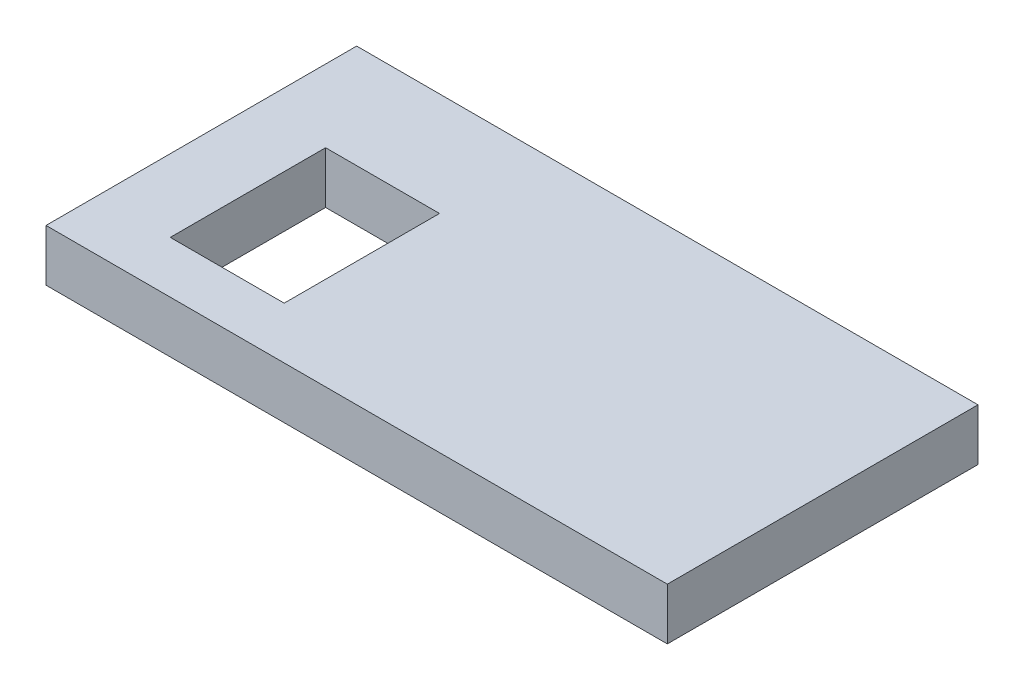
ISO-10303-21;
HEADER;
FILE_DESCRIPTION(('STEP AP214'),'2;1');
FILE_NAME('part.step','',(''),(''),'','','');
FILE_SCHEMA(('AUTOMOTIVE_DESIGN { 1 0 10303 214 1 1 1 1 }'));
ENDSEC;
DATA;
#1=APPLICATION_CONTEXT('core data for automotive mechanical design processes');
#2=APPLICATION_PROTOCOL_DEFINITION('international standard','automotive_design',2000,#1);
#3=PRODUCT_CONTEXT('',#1,'mechanical');
#4=PRODUCT('Part','Part','',(#3));
#5=PRODUCT_RELATED_PRODUCT_CATEGORY('part','',(#4));
#6=PRODUCT_DEFINITION_FORMATION('','',#4);
#7=PRODUCT_DEFINITION_CONTEXT('part definition',#1,'design');
#8=PRODUCT_DEFINITION('design','',#6,#7);
#9=PRODUCT_DEFINITION_SHAPE('','',#8);
#10=(LENGTH_UNIT() NAMED_UNIT(*) SI_UNIT(.MILLI.,.METRE.));
#11=(NAMED_UNIT(*) PLANE_ANGLE_UNIT() SI_UNIT($,.RADIAN.));
#12=(NAMED_UNIT(*) SI_UNIT($,.STERADIAN.) SOLID_ANGLE_UNIT());
#13=UNCERTAINTY_MEASURE_WITH_UNIT(LENGTH_MEASURE(1.E-05),#10,'distance_accuracy_value','');
#14=(GEOMETRIC_REPRESENTATION_CONTEXT(3) GLOBAL_UNCERTAINTY_ASSIGNED_CONTEXT((#13)) GLOBAL_UNIT_ASSIGNED_CONTEXT((#10,
#11,#12)) REPRESENTATION_CONTEXT('',''));
#15=CARTESIAN_POINT('',(0.,0.,0.));
#16=DIRECTION('',(0.,0.,1.));
#17=DIRECTION('',(1.,0.,0.));
#18=AXIS2_PLACEMENT_3D('',#15,#16,#17);
#19=CARTESIAN_POINT('',(60.,10.,-25.));
#20=DIRECTION('',(-1.,0.,0.));
#21=DIRECTION('',(0.,0.,1.));
#22=AXIS2_PLACEMENT_3D('',#19,#20,#21);
#23=PLANE('',#22);
#24=DIRECTION('',(0.,0.,-1.));
#25=VECTOR('',#24,1.);
#26=CARTESIAN_POINT('',(60.,0.,-25.));
#27=LINE('',#26,#25);
#28=CARTESIAN_POINT('',(60.,0.,25.));
#29=VERTEX_POINT('',#28);
#30=CARTESIAN_POINT('',(60.,0.,-35.));
#31=VERTEX_POINT('',#30);
#32=EDGE_CURVE('E113',#29,#31,#27,.T.);
#33=ORIENTED_EDGE('',*,*,#32,.T.);
#34=DIRECTION('',(0.,1.,0.));
#35=VECTOR('',#34,1.);
#36=CARTESIAN_POINT('',(60.,-120.415945787923,-35.));
#37=LINE('',#36,#35);
#38=CARTESIAN_POINT('',(60.,10.,-35.));
#39=VERTEX_POINT('',#38);
#40=EDGE_CURVE('E111',#31,#39,#37,.T.);
#41=ORIENTED_EDGE('',*,*,#40,.T.);
#42=DIRECTION('',(0.,0.,-1.));
#43=VECTOR('',#42,1.);
#44=CARTESIAN_POINT('',(60.,10.,-25.));
#45=LINE('',#44,#43);
#46=CARTESIAN_POINT('',(60.,10.,25.));
#47=VERTEX_POINT('',#46);
#48=EDGE_CURVE('E97',#47,#39,#45,.T.);
#49=ORIENTED_EDGE('',*,*,#48,.F.);
#50=DIRECTION('',(0.,-1.,0.));
#51=VECTOR('',#50,1.);
#52=CARTESIAN_POINT('',(60.,10.,25.));
#53=LINE('',#52,#51);
#54=EDGE_CURVE('E40',#47,#29,#53,.T.);
#55=ORIENTED_EDGE('',*,*,#54,.T.);
#56=EDGE_LOOP('',(#33,#41,#49,#55));
#57=FACE_BOUND('',#56,.T.);
#58=ADVANCED_FACE('F33',(#57),#23,.F.);
#59=CARTESIAN_POINT('',(-60.,10.,-25.));
#60=DIRECTION('',(1.,0.,0.));
#61=DIRECTION('',(0.,0.,-1.));
#62=AXIS2_PLACEMENT_3D('',#59,#60,#61);
#63=PLANE('',#62);
#64=DIRECTION('',(0.,0.,1.));
#65=VECTOR('',#64,1.);
#66=CARTESIAN_POINT('',(-60.,0.,-25.));
#67=LINE('',#66,#65);
#68=CARTESIAN_POINT('',(-60.,0.,-35.));
#69=VERTEX_POINT('',#68);
#70=CARTESIAN_POINT('',(-60.,0.,25.));
#71=VERTEX_POINT('',#70);
#72=EDGE_CURVE('E158',#69,#71,#67,.T.);
#73=ORIENTED_EDGE('',*,*,#72,.T.);
#74=DIRECTION('',(0.,-1.,0.));
#75=VECTOR('',#74,1.);
#76=CARTESIAN_POINT('',(-60.,10.,25.));
#77=LINE('',#76,#75);
#78=CARTESIAN_POINT('',(-60.,10.,25.));
#79=VERTEX_POINT('',#78);
#80=EDGE_CURVE('E11',#79,#71,#77,.T.);
#81=ORIENTED_EDGE('',*,*,#80,.F.);
#82=DIRECTION('',(0.,0.,1.));
#83=VECTOR('',#82,1.);
#84=CARTESIAN_POINT('',(-60.,10.,-25.));
#85=LINE('',#84,#83);
#86=CARTESIAN_POINT('',(-60.,10.,-35.));
#87=VERTEX_POINT('',#86);
#88=EDGE_CURVE('E107',#87,#79,#85,.T.);
#89=ORIENTED_EDGE('',*,*,#88,.F.);
#90=DIRECTION('',(0.,1.,0.));
#91=VECTOR('',#90,1.);
#92=CARTESIAN_POINT('',(-60.,-120.415945787923,-35.));
#93=LINE('',#92,#91);
#94=EDGE_CURVE('E117',#69,#87,#93,.T.);
#95=ORIENTED_EDGE('',*,*,#94,.F.);
#96=EDGE_LOOP('',(#73,#81,#89,#95));
#97=FACE_BOUND('',#96,.T.);
#98=ADVANCED_FACE('F166',(#97),#63,.F.);
#99=CARTESIAN_POINT('',(-60.,10.,25.));
#100=DIRECTION('',(0.,0.,-1.));
#101=DIRECTION('',(-1.,0.,0.));
#102=AXIS2_PLACEMENT_3D('',#99,#100,#101);
#103=PLANE('',#102);
#104=DIRECTION('',(1.,0.,0.));
#105=VECTOR('',#104,1.);
#106=CARTESIAN_POINT('',(-60.,0.,25.));
#107=LINE('',#106,#105);
#108=EDGE_CURVE('E108',#71,#29,#107,.T.);
#109=ORIENTED_EDGE('',*,*,#108,.T.);
#110=ORIENTED_EDGE('',*,*,#54,.F.);
#111=DIRECTION('',(1.,0.,0.));
#112=VECTOR('',#111,1.);
#113=CARTESIAN_POINT('',(-60.,10.,25.));
#114=LINE('',#113,#112);
#115=EDGE_CURVE('E103',#79,#47,#114,.T.);
#116=ORIENTED_EDGE('',*,*,#115,.F.);
#117=ORIENTED_EDGE('',*,*,#80,.T.);
#118=EDGE_LOOP('',(#109,#110,#116,#117));
#119=FACE_BOUND('',#118,.T.);
#120=ADVANCED_FACE('F167',(#119),#103,.F.);
#121=CARTESIAN_POINT('',(0.,10.,0.));
#122=DIRECTION('',(0.,1.,0.));
#123=DIRECTION('',(0.,0.,1.));
#124=AXIS2_PLACEMENT_3D('',#121,#122,#123);
#125=PLANE('',#124);
#126=DIRECTION('',(0.,0.,-1.));
#127=VECTOR('',#126,1.);
#128=CARTESIAN_POINT('',(-24.,10.,-15.));
#129=LINE('',#128,#127);
#130=CARTESIAN_POINT('',(-24.,10.,15.));
#131=VERTEX_POINT('',#130);
#132=CARTESIAN_POINT('',(-24.,10.,-15.));
#133=VERTEX_POINT('',#132);
#134=EDGE_CURVE('E47',#131,#133,#129,.T.);
#135=ORIENTED_EDGE('',*,*,#134,.F.);
#136=DIRECTION('',(1.,0.,0.));
#137=VECTOR('',#136,1.);
#138=CARTESIAN_POINT('',(-46.,10.,15.));
#139=LINE('',#138,#137);
#140=CARTESIAN_POINT('',(-46.,10.,15.));
#141=VERTEX_POINT('',#140);
#142=EDGE_CURVE('E131',#141,#131,#139,.T.);
#143=ORIENTED_EDGE('',*,*,#142,.F.);
#144=DIRECTION('',(0.,0.,1.));
#145=VECTOR('',#144,1.);
#146=CARTESIAN_POINT('',(-46.,10.,-15.));
#147=LINE('',#146,#145);
#148=CARTESIAN_POINT('',(-46.,10.,-15.));
#149=VERTEX_POINT('',#148);
#150=EDGE_CURVE('E143',#149,#141,#147,.T.);
#151=ORIENTED_EDGE('',*,*,#150,.F.);
#152=DIRECTION('',(-1.,0.,0.));
#153=VECTOR('',#152,1.);
#154=CARTESIAN_POINT('',(-46.,10.,-15.));
#155=LINE('',#154,#153);
#156=EDGE_CURVE('E140',#133,#149,#155,.T.);
#157=ORIENTED_EDGE('',*,*,#156,.F.);
#158=EDGE_LOOP('',(#135,#143,#151,#157));
#159=FACE_BOUND('',#158,.T.);
#160=ORIENTED_EDGE('',*,*,#48,.T.);
#161=DIRECTION('',(-1.,0.,0.));
#162=VECTOR('',#161,1.);
#163=CARTESIAN_POINT('',(60.,10.,-35.));
#164=LINE('',#163,#162);
#165=EDGE_CURVE('E101',#39,#87,#164,.T.);
#166=ORIENTED_EDGE('',*,*,#165,.T.);
#167=ORIENTED_EDGE('',*,*,#88,.T.);
#168=ORIENTED_EDGE('',*,*,#115,.T.);
#169=EDGE_LOOP('',(#160,#166,#167,#168));
#170=FACE_BOUND('',#169,.T.);
#171=ADVANCED_FACE('F99',(#159,#170),#125,.T.);
#172=CARTESIAN_POINT('',(0.,0.,0.));
#173=DIRECTION('',(0.,1.,0.));
#174=DIRECTION('',(0.,0.,1.));
#175=AXIS2_PLACEMENT_3D('',#172,#173,#174);
#176=PLANE('',#175);
#177=DIRECTION('',(1.,0.,0.));
#178=VECTOR('',#177,1.);
#179=CARTESIAN_POINT('',(-46.,0.,15.));
#180=LINE('',#179,#178);
#181=CARTESIAN_POINT('',(-46.,0.,15.));
#182=VERTEX_POINT('',#181);
#183=CARTESIAN_POINT('',(-24.,0.,15.));
#184=VERTEX_POINT('',#183);
#185=EDGE_CURVE('E135',#182,#184,#180,.T.);
#186=ORIENTED_EDGE('',*,*,#185,.T.);
#187=DIRECTION('',(0.,0.,-1.));
#188=VECTOR('',#187,1.);
#189=CARTESIAN_POINT('',(-24.,0.,-15.));
#190=LINE('',#189,#188);
#191=CARTESIAN_POINT('',(-24.,0.,-15.));
#192=VERTEX_POINT('',#191);
#193=EDGE_CURVE('E127',#184,#192,#190,.T.);
#194=ORIENTED_EDGE('',*,*,#193,.T.);
#195=DIRECTION('',(-1.,0.,0.));
#196=VECTOR('',#195,1.);
#197=CARTESIAN_POINT('',(-46.,0.,-15.));
#198=LINE('',#197,#196);
#199=CARTESIAN_POINT('',(-46.,0.,-15.));
#200=VERTEX_POINT('',#199);
#201=EDGE_CURVE('E130',#192,#200,#198,.T.);
#202=ORIENTED_EDGE('',*,*,#201,.T.);
#203=DIRECTION('',(0.,0.,1.));
#204=VECTOR('',#203,1.);
#205=CARTESIAN_POINT('',(-46.,0.,-15.));
#206=LINE('',#205,#204);
#207=EDGE_CURVE('E55',#200,#182,#206,.T.);
#208=ORIENTED_EDGE('',*,*,#207,.T.);
#209=EDGE_LOOP('',(#186,#194,#202,#208));
#210=FACE_BOUND('',#209,.T.);
#211=ORIENTED_EDGE('',*,*,#32,.F.);
#212=ORIENTED_EDGE('',*,*,#108,.F.);
#213=ORIENTED_EDGE('',*,*,#72,.F.);
#214=DIRECTION('',(1.,0.,0.));
#215=VECTOR('',#214,1.);
#216=CARTESIAN_POINT('',(60.,0.,-35.));
#217=LINE('',#216,#215);
#218=EDGE_CURVE('E124',#69,#31,#217,.T.);
#219=ORIENTED_EDGE('',*,*,#218,.T.);
#220=EDGE_LOOP('',(#211,#212,#213,#219));
#221=FACE_BOUND('',#220,.T.);
#222=ADVANCED_FACE('F163',(#210,#221),#176,.F.);
#223=CARTESIAN_POINT('',(-24.,0.,-15.));
#224=DIRECTION('',(1.,0.,0.));
#225=DIRECTION('',(0.,0.,-1.));
#226=AXIS2_PLACEMENT_3D('',#223,#224,#225);
#227=PLANE('',#226);
#228=ORIENTED_EDGE('',*,*,#134,.T.);
#229=DIRECTION('',(0.,1.,0.));
#230=VECTOR('',#229,1.);
#231=CARTESIAN_POINT('',(-24.,0.,-15.));
#232=LINE('',#231,#230);
#233=EDGE_CURVE('E138',#192,#133,#232,.T.);
#234=ORIENTED_EDGE('',*,*,#233,.F.);
#235=ORIENTED_EDGE('',*,*,#193,.F.);
#236=DIRECTION('',(0.,1.,0.));
#237=VECTOR('',#236,1.);
#238=CARTESIAN_POINT('',(-24.,0.,15.));
#239=LINE('',#238,#237);
#240=EDGE_CURVE('E148',#184,#131,#239,.T.);
#241=ORIENTED_EDGE('',*,*,#240,.T.);
#242=EDGE_LOOP('',(#228,#234,#235,#241));
#243=FACE_BOUND('',#242,.T.);
#244=ADVANCED_FACE('F202',(#243),#227,.F.);
#245=CARTESIAN_POINT('',(-46.,0.,15.));
#246=DIRECTION('',(0.,0.,1.));
#247=DIRECTION('',(1.,0.,0.));
#248=AXIS2_PLACEMENT_3D('',#245,#246,#247);
#249=PLANE('',#248);
#250=ORIENTED_EDGE('',*,*,#142,.T.);
#251=ORIENTED_EDGE('',*,*,#240,.F.);
#252=ORIENTED_EDGE('',*,*,#185,.F.);
#253=DIRECTION('',(0.,1.,0.));
#254=VECTOR('',#253,1.);
#255=CARTESIAN_POINT('',(-46.,0.,15.));
#256=LINE('',#255,#254);
#257=EDGE_CURVE('E150',#182,#141,#256,.T.);
#258=ORIENTED_EDGE('',*,*,#257,.T.);
#259=EDGE_LOOP('',(#250,#251,#252,#258));
#260=FACE_BOUND('',#259,.T.);
#261=ADVANCED_FACE('F228',(#260),#249,.F.);
#262=CARTESIAN_POINT('',(-46.,0.,-15.));
#263=DIRECTION('',(-1.,0.,0.));
#264=DIRECTION('',(0.,0.,1.));
#265=AXIS2_PLACEMENT_3D('',#262,#263,#264);
#266=PLANE('',#265);
#267=ORIENTED_EDGE('',*,*,#150,.T.);
#268=ORIENTED_EDGE('',*,*,#257,.F.);
#269=ORIENTED_EDGE('',*,*,#207,.F.);
#270=DIRECTION('',(0.,1.,0.));
#271=VECTOR('',#270,1.);
#272=CARTESIAN_POINT('',(-46.,0.,-15.));
#273=LINE('',#272,#271);
#274=EDGE_CURVE('E152',#200,#149,#273,.T.);
#275=ORIENTED_EDGE('',*,*,#274,.T.);
#276=EDGE_LOOP('',(#267,#268,#269,#275));
#277=FACE_BOUND('',#276,.T.);
#278=ADVANCED_FACE('F220',(#277),#266,.F.);
#279=CARTESIAN_POINT('',(-46.,0.,-15.));
#280=DIRECTION('',(0.,0.,-1.));
#281=DIRECTION('',(-1.,0.,0.));
#282=AXIS2_PLACEMENT_3D('',#279,#280,#281);
#283=PLANE('',#282);
#284=ORIENTED_EDGE('',*,*,#156,.T.);
#285=ORIENTED_EDGE('',*,*,#274,.F.);
#286=ORIENTED_EDGE('',*,*,#201,.F.);
#287=ORIENTED_EDGE('',*,*,#233,.T.);
#288=EDGE_LOOP('',(#284,#285,#286,#287));
#289=FACE_BOUND('',#288,.T.);
#290=ADVANCED_FACE('F212',(#289),#283,.F.);
#291=CARTESIAN_POINT('',(60.,-120.415945787923,-35.));
#292=DIRECTION('',(0.,0.,-1.));
#293=DIRECTION('',(-1.,0.,0.));
#294=AXIS2_PLACEMENT_3D('',#291,#292,#293);
#295=PLANE('',#294);
#296=ORIENTED_EDGE('',*,*,#218,.F.);
#297=ORIENTED_EDGE('',*,*,#94,.T.);
#298=ORIENTED_EDGE('',*,*,#165,.F.);
#299=ORIENTED_EDGE('',*,*,#40,.F.);
#300=EDGE_LOOP('',(#296,#297,#298,#299));
#301=FACE_BOUND('',#300,.T.);
#302=ADVANCED_FACE('F120',(#301),#295,.T.);
#303=CLOSED_SHELL('',(#58,#98,#120,#171,#222,#244,#261,#278,#290,#302));
#304=MANIFOLD_SOLID_BREP('B2',#303);
#305=ADVANCED_BREP_SHAPE_REPRESENTATION('',(#18,#304),#14);
#306=SHAPE_DEFINITION_REPRESENTATION(#9,#305);
ENDSEC;
END-ISO-10303-21;
